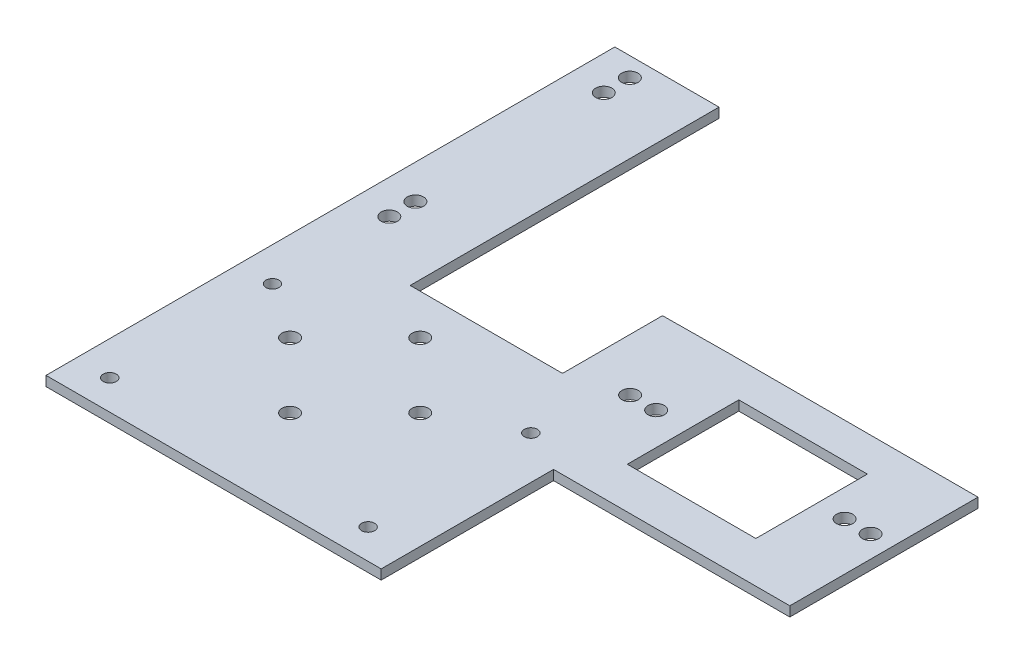
ISO-10303-21;
HEADER;
FILE_DESCRIPTION(('STEP AP214'),'2;1');
FILE_NAME('part.step','',(''),(''),'','','');
FILE_SCHEMA(('AUTOMOTIVE_DESIGN { 1 0 10303 214 1 1 1 1 }'));
ENDSEC;
DATA;
#1=APPLICATION_CONTEXT('core data for automotive mechanical design processes');
#2=APPLICATION_PROTOCOL_DEFINITION('international standard','automotive_design',2000,#1);
#3=PRODUCT_CONTEXT('',#1,'mechanical');
#4=PRODUCT('Part','Part','',(#3));
#5=PRODUCT_RELATED_PRODUCT_CATEGORY('part','',(#4));
#6=PRODUCT_DEFINITION_FORMATION('','',#4);
#7=PRODUCT_DEFINITION_CONTEXT('part definition',#1,'design');
#8=PRODUCT_DEFINITION('design','',#6,#7);
#9=PRODUCT_DEFINITION_SHAPE('','',#8);
#10=(LENGTH_UNIT() NAMED_UNIT(*) SI_UNIT(.MILLI.,.METRE.));
#11=(NAMED_UNIT(*) PLANE_ANGLE_UNIT() SI_UNIT($,.RADIAN.));
#12=(NAMED_UNIT(*) SI_UNIT($,.STERADIAN.) SOLID_ANGLE_UNIT());
#13=UNCERTAINTY_MEASURE_WITH_UNIT(LENGTH_MEASURE(1.E-05),#10,'distance_accuracy_value','');
#14=(GEOMETRIC_REPRESENTATION_CONTEXT(3) GLOBAL_UNCERTAINTY_ASSIGNED_CONTEXT((#13)) GLOBAL_UNIT_ASSIGNED_CONTEXT((#10,
#11,#12)) REPRESENTATION_CONTEXT('',''));
#15=CARTESIAN_POINT('',(0.,0.,0.));
#16=DIRECTION('',(0.,0.,1.));
#17=DIRECTION('',(1.,0.,0.));
#18=AXIS2_PLACEMENT_3D('',#15,#16,#17);
#19=CARTESIAN_POINT('',(0.,3.,0.));
#20=DIRECTION('',(0.,1.,0.));
#21=DIRECTION('',(0.,0.,1.));
#22=AXIS2_PLACEMENT_3D('',#19,#20,#21);
#23=PLANE('',#22);
#24=CARTESIAN_POINT('',(-89.5634434686842,3.,39.0070541785448));
#25=DIRECTION('',(0.,1.,0.));
#26=DIRECTION('',(0.,0.,1.));
#27=AXIS2_PLACEMENT_3D('',#24,#25,#26);
#28=CIRCLE('',#27,2.);
#29=CARTESIAN_POINT('',(-89.5634434686842,3.,41.0070541785448));
#30=VERTEX_POINT('',#29);
#31=EDGE_CURVE('E562',#30,#30,#28,.T.);
#32=ORIENTED_EDGE('',*,*,#31,.F.);
#33=EDGE_LOOP('',(#32));
#34=FACE_BOUND('',#33,.T.);
#35=CARTESIAN_POINT('',(-10.1646335647985,3.,89.0070541785448));
#36=DIRECTION('',(0.,1.,0.));
#37=DIRECTION('',(0.,0.,1.));
#38=AXIS2_PLACEMENT_3D('',#35,#36,#37);
#39=CIRCLE('',#38,2.);
#40=CARTESIAN_POINT('',(-10.1646335647985,3.,91.0070541785448));
#41=VERTEX_POINT('',#40);
#42=EDGE_CURVE('E560',#41,#41,#39,.T.);
#43=ORIENTED_EDGE('',*,*,#42,.F.);
#44=EDGE_LOOP('',(#43));
#45=FACE_BOUND('',#44,.T.);
#46=CARTESIAN_POINT('',(-89.5634434686841,3.,89.0070541785448));
#47=DIRECTION('',(0.,1.,0.));
#48=DIRECTION('',(0.,0.,1.));
#49=AXIS2_PLACEMENT_3D('',#46,#47,#48);
#50=CIRCLE('',#49,2.);
#51=CARTESIAN_POINT('',(-89.5634434686841,3.,91.0070541785448));
#52=VERTEX_POINT('',#51);
#53=EDGE_CURVE('E330',#52,#52,#50,.T.);
#54=ORIENTED_EDGE('',*,*,#53,.F.);
#55=EDGE_LOOP('',(#54));
#56=FACE_BOUND('',#55,.T.);
#57=CARTESIAN_POINT('',(-10.1646335647986,3.,39.0070541785448));
#58=DIRECTION('',(0.,1.,0.));
#59=DIRECTION('',(0.,0.,1.));
#60=AXIS2_PLACEMENT_3D('',#57,#58,#59);
#61=CIRCLE('',#60,2.);
#62=CARTESIAN_POINT('',(-10.1646335647986,3.,41.0070541785448));
#63=VERTEX_POINT('',#62);
#64=EDGE_CURVE('E565',#63,#63,#61,.T.);
#65=ORIENTED_EDGE('',*,*,#64,.F.);
#66=EDGE_LOOP('',(#65));
#67=FACE_BOUND('',#66,.T.);
#68=CARTESIAN_POINT('',(3.00000000000002,3.,13.6576257908728));
#69=DIRECTION('',(0.,1.,0.));
#70=DIRECTION('',(0.,0.,1.));
#71=AXIS2_PLACEMENT_3D('',#68,#69,#70);
#72=CIRCLE('',#71,2.5);
#73=CARTESIAN_POINT('',(3.00000000000002,3.,16.1576257908728));
#74=VERTEX_POINT('',#73);
#75=EDGE_CURVE('E185',#74,#74,#72,.T.);
#76=ORIENTED_EDGE('',*,*,#75,.F.);
#77=EDGE_LOOP('',(#76));
#78=FACE_BOUND('',#77,.T.);
#79=CARTESIAN_POINT('',(-89.4999999999999,3.,-4.84237420912721));
#80=DIRECTION('',(0.,1.,0.));
#81=DIRECTION('',(0.,0.,1.));
#82=AXIS2_PLACEMENT_3D('',#79,#80,#81);
#83=CIRCLE('',#82,2.5);
#84=CARTESIAN_POINT('',(-89.4999999999999,3.,-2.34237420912722));
#85=VERTEX_POINT('',#84);
#86=EDGE_CURVE('E197',#85,#85,#83,.T.);
#87=ORIENTED_EDGE('',*,*,#86,.F.);
#88=EDGE_LOOP('',(#87));
#89=FACE_BOUND('',#88,.T.);
#90=CARTESIAN_POINT('',(-89.4999999999998,3.,3.15762579087278));
#91=DIRECTION('',(0.,1.,0.));
#92=DIRECTION('',(0.,0.,1.));
#93=AXIS2_PLACEMENT_3D('',#90,#91,#92);
#94=CIRCLE('',#93,2.5);
#95=CARTESIAN_POINT('',(-89.4999999999998,3.,5.65762579087278));
#96=VERTEX_POINT('',#95);
#97=EDGE_CURVE('E209',#96,#96,#94,.T.);
#98=ORIENTED_EDGE('',*,*,#97,.F.);
#99=EDGE_LOOP('',(#98));
#100=FACE_BOUND('',#99,.T.);
#101=CARTESIAN_POINT('',(-32.4999999999998,3.,50.6576257908729));
#102=DIRECTION('',(0.,1.,0.));
#103=DIRECTION('',(0.,0.,1.));
#104=AXIS2_PLACEMENT_3D('',#101,#102,#103);
#105=CIRCLE('',#104,2.5);
#106=CARTESIAN_POINT('',(-32.4999999999998,3.,53.1576257908729));
#107=VERTEX_POINT('',#106);
#108=EDGE_CURVE('E221',#107,#107,#105,.T.);
#109=ORIENTED_EDGE('',*,*,#108,.F.);
#110=EDGE_LOOP('',(#109));
#111=FACE_BOUND('',#110,.T.);
#112=CARTESIAN_POINT('',(-72.4999999999992,3.,50.6576257908734));
#113=DIRECTION('',(0.,1.,0.));
#114=DIRECTION('',(0.,0.,1.));
#115=AXIS2_PLACEMENT_3D('',#112,#113,#114);
#116=CIRCLE('',#115,2.5);
#117=CARTESIAN_POINT('',(-72.4999999999992,3.,53.1576257908734));
#118=VERTEX_POINT('',#117);
#119=EDGE_CURVE('E233',#118,#118,#116,.T.);
#120=ORIENTED_EDGE('',*,*,#119,.F.);
#121=EDGE_LOOP('',(#120));
#122=FACE_BOUND('',#121,.T.);
#123=CARTESIAN_POINT('',(-52.5,3.,70.6576257908728));
#124=DIRECTION('',(0.,1.,0.));
#125=DIRECTION('',(0.,0.,1.));
#126=AXIS2_PLACEMENT_3D('',#123,#124,#125);
#127=CIRCLE('',#126,2.5);
#128=CARTESIAN_POINT('',(-52.5,3.,73.1576257908728));
#129=VERTEX_POINT('',#128);
#130=EDGE_CURVE('E245',#129,#129,#127,.T.);
#131=ORIENTED_EDGE('',*,*,#130,.F.);
#132=EDGE_LOOP('',(#131));
#133=FACE_BOUND('',#132,.T.);
#134=DIRECTION('',(1.,0.,0.));
#135=VECTOR('',#134,1.);
#136=CARTESIAN_POINT('',(-100.,3.,98.1576257908728));
#137=LINE('',#136,#135);
#138=CARTESIAN_POINT('',(-100.,3.,98.1576257908728));
#139=VERTEX_POINT('',#138);
#140=CARTESIAN_POINT('',(3.00000000000003,3.,98.1576257908728));
#141=VERTEX_POINT('',#140);
#142=EDGE_CURVE('E251',#139,#141,#137,.T.);
#143=ORIENTED_EDGE('',*,*,#142,.T.);
#144=DIRECTION('',(0.,0.,-1.));
#145=VECTOR('',#144,1.);
#146=CARTESIAN_POINT('',(3.00000000000003,3.,98.1576257908728));
#147=LINE('',#146,#145);
#148=CARTESIAN_POINT('',(3.00000000000003,3.,45.195936931762));
#149=VERTEX_POINT('',#148);
#150=EDGE_CURVE('E254',#141,#149,#147,.T.);
#151=ORIENTED_EDGE('',*,*,#150,.T.);
#152=DIRECTION('',(1.,0.,0.));
#153=VECTOR('',#152,1.);
#154=CARTESIAN_POINT('',(3.00000000000003,3.,45.195936931762));
#155=LINE('',#154,#153);
#156=CARTESIAN_POINT('',(75.6040568869683,3.,45.195936931762));
#157=VERTEX_POINT('',#156);
#158=EDGE_CURVE('E257',#149,#157,#155,.T.);
#159=ORIENTED_EDGE('',*,*,#158,.T.);
#160=DIRECTION('',(0.,0.,-1.));
#161=VECTOR('',#160,1.);
#162=CARTESIAN_POINT('',(75.6040568869683,3.,45.195936931762));
#163=LINE('',#162,#161);
#164=CARTESIAN_POINT('',(75.6040568869683,3.,-12.6368662491991));
#165=VERTEX_POINT('',#164);
#166=EDGE_CURVE('E259',#157,#165,#163,.T.);
#167=ORIENTED_EDGE('',*,*,#166,.T.);
#168=DIRECTION('',(-1.,0.,0.));
#169=VECTOR('',#168,1.);
#170=CARTESIAN_POINT('',(75.6040568869683,3.,-12.6368662491991));
#171=LINE('',#170,#169);
#172=CARTESIAN_POINT('',(-0.589568200358312,3.,-12.6368662491991));
#173=VERTEX_POINT('',#172);
#174=EDGE_CURVE('E261',#165,#173,#171,.T.);
#175=ORIENTED_EDGE('',*,*,#174,.T.);
#176=DIRECTION('',(-0.999957442788699,0.,0.00922564965119329));
#177=VECTOR('',#176,1.);
#178=CARTESIAN_POINT('',(-0.589568200358312,3.,-12.6368662491991));
#179=LINE('',#178,#177);
#180=CARTESIAN_POINT('',(-21.1648115551885,3.,-12.4470381839663));
#181=VERTEX_POINT('',#180);
#182=EDGE_CURVE('E263',#173,#181,#179,.T.);
#183=ORIENTED_EDGE('',*,*,#182,.T.);
#184=DIRECTION('',(0.,0.,1.));
#185=VECTOR('',#184,1.);
#186=CARTESIAN_POINT('',(-21.1648115551885,3.,-12.4470381839663));
#187=LINE('',#186,#185);
#188=CARTESIAN_POINT('',(-21.1648115551885,3.,18.2712434781188));
#189=VERTEX_POINT('',#188);
#190=EDGE_CURVE('E265',#181,#189,#187,.T.);
#191=ORIENTED_EDGE('',*,*,#190,.T.);
#192=DIRECTION('',(-1.,0.,0.));
#193=VECTOR('',#192,1.);
#194=CARTESIAN_POINT('',(-67.9806976310952,3.,18.2712434781188));
#195=LINE('',#194,#193);
#196=CARTESIAN_POINT('',(-67.9806976310952,3.,18.2712434781188));
#197=VERTEX_POINT('',#196);
#198=EDGE_CURVE('E267',#189,#197,#195,.T.);
#199=ORIENTED_EDGE('',*,*,#198,.T.);
#200=DIRECTION('',(0.,0.,-1.));
#201=VECTOR('',#200,1.);
#202=CARTESIAN_POINT('',(-67.9806976310952,3.,-12.6368662491991));
#203=LINE('',#202,#201);
#204=CARTESIAN_POINT('',(-67.9806976310952,3.,-76.642236504679));
#205=VERTEX_POINT('',#204);
#206=EDGE_CURVE('E269',#197,#205,#203,.T.);
#207=ORIENTED_EDGE('',*,*,#206,.T.);
#208=DIRECTION('',(-1.,0.,0.));
#209=VECTOR('',#208,1.);
#210=CARTESIAN_POINT('',(-100.,3.,-76.642236504679));
#211=LINE('',#210,#209);
#212=CARTESIAN_POINT('',(-100.,3.,-76.642236504679));
#213=VERTEX_POINT('',#212);
#214=EDGE_CURVE('E271',#205,#213,#211,.T.);
#215=ORIENTED_EDGE('',*,*,#214,.T.);
#216=DIRECTION('',(0.,0.,1.));
#217=VECTOR('',#216,1.);
#218=CARTESIAN_POINT('',(-100.,3.,-76.642236504679));
#219=LINE('',#218,#217);
#220=EDGE_CURVE('E273',#213,#139,#219,.T.);
#221=ORIENTED_EDGE('',*,*,#220,.T.);
#222=EDGE_LOOP('',(#143,#151,#159,#167,#175,#183,#191,#199,#207,#215,#221));
#223=FACE_BOUND('',#222,.T.);
#224=CARTESIAN_POINT('',(-4.99999999999998,3.,13.6576257908728));
#225=DIRECTION('',(0.,1.,0.));
#226=DIRECTION('',(0.,0.,1.));
#227=AXIS2_PLACEMENT_3D('',#224,#225,#226);
#228=CIRCLE('',#227,2.5);
#229=CARTESIAN_POINT('',(-4.99999999999998,3.,16.1576257908728));
#230=VERTEX_POINT('',#229);
#231=EDGE_CURVE('E239',#230,#230,#228,.T.);
#232=ORIENTED_EDGE('',*,*,#231,.F.);
#233=EDGE_LOOP('',(#232));
#234=FACE_BOUND('',#233,.T.);
#235=CARTESIAN_POINT('',(-52.4999999999998,3.,30.6576257908728));
#236=DIRECTION('',(0.,1.,0.));
#237=DIRECTION('',(0.,0.,1.));
#238=AXIS2_PLACEMENT_3D('',#235,#236,#237);
#239=CIRCLE('',#238,2.5);
#240=CARTESIAN_POINT('',(-52.4999999999998,3.,33.1576257908728));
#241=VERTEX_POINT('',#240);
#242=EDGE_CURVE('E227',#241,#241,#239,.T.);
#243=ORIENTED_EDGE('',*,*,#242,.F.);
#244=EDGE_LOOP('',(#243));
#245=FACE_BOUND('',#244,.T.);
#246=CARTESIAN_POINT('',(60.9,3.,13.6576257908728));
#247=DIRECTION('',(0.,1.,0.));
#248=DIRECTION('',(0.,0.,1.));
#249=AXIS2_PLACEMENT_3D('',#246,#247,#248);
#250=CIRCLE('',#249,2.50000000000001);
#251=CARTESIAN_POINT('',(60.9,3.,16.1576257908728));
#252=VERTEX_POINT('',#251);
#253=EDGE_CURVE('E215',#252,#252,#250,.T.);
#254=ORIENTED_EDGE('',*,*,#253,.F.);
#255=EDGE_LOOP('',(#254));
#256=FACE_BOUND('',#255,.T.);
#257=CARTESIAN_POINT('',(-89.4999999999998,3.,-62.7423742091272));
#258=DIRECTION('',(0.,1.,0.));
#259=DIRECTION('',(0.,0.,1.));
#260=AXIS2_PLACEMENT_3D('',#257,#258,#259);
#261=CIRCLE('',#260,2.5);
#262=CARTESIAN_POINT('',(-89.4999999999998,3.,-60.2423742091272));
#263=VERTEX_POINT('',#262);
#264=EDGE_CURVE('E203',#263,#263,#261,.T.);
#265=ORIENTED_EDGE('',*,*,#264,.F.);
#266=EDGE_LOOP('',(#265));
#267=FACE_BOUND('',#266,.T.);
#268=CARTESIAN_POINT('',(-89.4999999999999,3.,-70.7423742091272));
#269=DIRECTION('',(0.,1.,0.));
#270=DIRECTION('',(0.,0.,1.));
#271=AXIS2_PLACEMENT_3D('',#268,#269,#270);
#272=CIRCLE('',#271,2.5);
#273=CARTESIAN_POINT('',(-89.4999999999999,3.,-68.2423742091272));
#274=VERTEX_POINT('',#273);
#275=EDGE_CURVE('E191',#274,#274,#272,.T.);
#276=ORIENTED_EDGE('',*,*,#275,.F.);
#277=EDGE_LOOP('',(#276));
#278=FACE_BOUND('',#277,.T.);
#279=CARTESIAN_POINT('',(68.9,3.,13.6576257908728));
#280=DIRECTION('',(0.,1.,0.));
#281=DIRECTION('',(0.,0.,1.));
#282=AXIS2_PLACEMENT_3D('',#279,#280,#281);
#283=CIRCLE('',#282,2.5);
#284=CARTESIAN_POINT('',(68.9,3.,16.1576257908728));
#285=VERTEX_POINT('',#284);
#286=EDGE_CURVE('E179',#285,#285,#283,.T.);
#287=ORIENTED_EDGE('',*,*,#286,.F.);
#288=EDGE_LOOP('',(#287));
#289=FACE_BOUND('',#288,.T.);
#290=DIRECTION('',(1.,0.,0.));
#291=VECTOR('',#290,1.);
#292=CARTESIAN_POINT('',(12.969330424242,3.,32.5));
#293=LINE('',#292,#291);
#294=CARTESIAN_POINT('',(12.969330424242,3.,32.5));
#295=VERTEX_POINT('',#294);
#296=CARTESIAN_POINT('',(52.4736011810755,3.,32.5));
#297=VERTEX_POINT('',#296);
#298=EDGE_CURVE('E150',#295,#297,#293,.T.);
#299=ORIENTED_EDGE('',*,*,#298,.F.);
#300=DIRECTION('',(0.,0.,1.));
#301=VECTOR('',#300,1.);
#302=CARTESIAN_POINT('',(12.969330424242,3.,-1.76660972980732));
#303=LINE('',#302,#301);
#304=CARTESIAN_POINT('',(12.969330424242,3.,-1.76660972980732));
#305=VERTEX_POINT('',#304);
#306=EDGE_CURVE('E142',#305,#295,#303,.T.);
#307=ORIENTED_EDGE('',*,*,#306,.F.);
#308=DIRECTION('',(-1.,0.,0.));
#309=VECTOR('',#308,1.);
#310=CARTESIAN_POINT('',(12.969330424242,3.,-1.76660972980732));
#311=LINE('',#310,#309);
#312=CARTESIAN_POINT('',(52.4736011810755,3.,-1.76660972980732));
#313=VERTEX_POINT('',#312);
#314=EDGE_CURVE('E164',#313,#305,#311,.T.);
#315=ORIENTED_EDGE('',*,*,#314,.F.);
#316=DIRECTION('',(0.,0.,-1.));
#317=VECTOR('',#316,1.);
#318=CARTESIAN_POINT('',(52.4736011810755,3.,-1.76660972980732));
#319=LINE('',#318,#317);
#320=EDGE_CURVE('E162',#297,#313,#319,.T.);
#321=ORIENTED_EDGE('',*,*,#320,.F.);
#322=EDGE_LOOP('',(#299,#307,#315,#321));
#323=FACE_BOUND('',#322,.T.);
#324=ADVANCED_FACE('F33',(#34,#45,#56,#67,#78,#89,#100,#111,#122,#133,#223,#234,#245,#256,#267,
#278,#289,#323),#23,.T.);
#325=CARTESIAN_POINT('',(0.,0.,0.));
#326=DIRECTION('',(0.,1.,0.));
#327=DIRECTION('',(0.,0.,1.));
#328=AXIS2_PLACEMENT_3D('',#325,#326,#327);
#329=PLANE('',#328);
#330=CARTESIAN_POINT('',(-89.5634434686842,0.,39.0070541785448));
#331=DIRECTION('',(0.,1.,0.));
#332=DIRECTION('',(0.,0.,1.));
#333=AXIS2_PLACEMENT_3D('',#330,#331,#332);
#334=CIRCLE('',#333,2.);
#335=CARTESIAN_POINT('',(-89.5634434686842,0.,41.0070541785448));
#336=VERTEX_POINT('',#335);
#337=EDGE_CURVE('E37',#336,#336,#334,.T.);
#338=ORIENTED_EDGE('',*,*,#337,.T.);
#339=EDGE_LOOP('',(#338));
#340=FACE_BOUND('',#339,.T.);
#341=CARTESIAN_POINT('',(-10.1646335647985,0.,89.0070541785448));
#342=DIRECTION('',(0.,1.,0.));
#343=DIRECTION('',(0.,0.,1.));
#344=AXIS2_PLACEMENT_3D('',#341,#342,#343);
#345=CIRCLE('',#344,2.);
#346=CARTESIAN_POINT('',(-10.1646335647985,0.,91.0070541785448));
#347=VERTEX_POINT('',#346);
#348=EDGE_CURVE('E332',#347,#347,#345,.T.);
#349=ORIENTED_EDGE('',*,*,#348,.T.);
#350=EDGE_LOOP('',(#349));
#351=FACE_BOUND('',#350,.T.);
#352=CARTESIAN_POINT('',(-89.5634434686841,0.,89.0070541785448));
#353=DIRECTION('',(0.,1.,0.));
#354=DIRECTION('',(0.,0.,1.));
#355=AXIS2_PLACEMENT_3D('',#352,#353,#354);
#356=CIRCLE('',#355,2.);
#357=CARTESIAN_POINT('',(-89.5634434686841,0.,91.0070541785448));
#358=VERTEX_POINT('',#357);
#359=EDGE_CURVE('E329',#358,#358,#356,.T.);
#360=ORIENTED_EDGE('',*,*,#359,.T.);
#361=EDGE_LOOP('',(#360));
#362=FACE_BOUND('',#361,.T.);
#363=CARTESIAN_POINT('',(-10.1646335647986,0.,39.0070541785448));
#364=DIRECTION('',(0.,1.,0.));
#365=DIRECTION('',(0.,0.,1.));
#366=AXIS2_PLACEMENT_3D('',#363,#364,#365);
#367=CIRCLE('',#366,2.);
#368=CARTESIAN_POINT('',(-10.1646335647986,0.,41.0070541785448));
#369=VERTEX_POINT('',#368);
#370=EDGE_CURVE('E326',#369,#369,#367,.T.);
#371=ORIENTED_EDGE('',*,*,#370,.T.);
#372=EDGE_LOOP('',(#371));
#373=FACE_BOUND('',#372,.T.);
#374=CARTESIAN_POINT('',(68.9,0.,13.6576257908728));
#375=DIRECTION('',(0.,1.,0.));
#376=DIRECTION('',(0.,0.,1.));
#377=AXIS2_PLACEMENT_3D('',#374,#375,#376);
#378=CIRCLE('',#377,2.5);
#379=CARTESIAN_POINT('',(68.9,0.,16.1576257908728));
#380=VERTEX_POINT('',#379);
#381=EDGE_CURVE('E158',#380,#380,#378,.T.);
#382=ORIENTED_EDGE('',*,*,#381,.T.);
#383=EDGE_LOOP('',(#382));
#384=FACE_BOUND('',#383,.T.);
#385=CARTESIAN_POINT('',(3.00000000000002,0.,13.6576257908728));
#386=DIRECTION('',(0.,1.,0.));
#387=DIRECTION('',(0.,0.,1.));
#388=AXIS2_PLACEMENT_3D('',#385,#386,#387);
#389=CIRCLE('',#388,2.5);
#390=CARTESIAN_POINT('',(3.00000000000002,0.,16.1576257908728));
#391=VERTEX_POINT('',#390);
#392=EDGE_CURVE('E182',#391,#391,#389,.T.);
#393=ORIENTED_EDGE('',*,*,#392,.T.);
#394=EDGE_LOOP('',(#393));
#395=FACE_BOUND('',#394,.T.);
#396=CARTESIAN_POINT('',(-89.4999999999999,0.,-70.7423742091272));
#397=DIRECTION('',(0.,1.,0.));
#398=DIRECTION('',(0.,0.,1.));
#399=AXIS2_PLACEMENT_3D('',#396,#397,#398);
#400=CIRCLE('',#399,2.5);
#401=CARTESIAN_POINT('',(-89.4999999999999,0.,-68.2423742091272));
#402=VERTEX_POINT('',#401);
#403=EDGE_CURVE('E188',#402,#402,#400,.T.);
#404=ORIENTED_EDGE('',*,*,#403,.T.);
#405=EDGE_LOOP('',(#404));
#406=FACE_BOUND('',#405,.T.);
#407=CARTESIAN_POINT('',(-89.4999999999999,0.,-4.84237420912721));
#408=DIRECTION('',(0.,1.,0.));
#409=DIRECTION('',(0.,0.,1.));
#410=AXIS2_PLACEMENT_3D('',#407,#408,#409);
#411=CIRCLE('',#410,2.5);
#412=CARTESIAN_POINT('',(-89.4999999999999,0.,-2.34237420912722));
#413=VERTEX_POINT('',#412);
#414=EDGE_CURVE('E194',#413,#413,#411,.T.);
#415=ORIENTED_EDGE('',*,*,#414,.T.);
#416=EDGE_LOOP('',(#415));
#417=FACE_BOUND('',#416,.T.);
#418=CARTESIAN_POINT('',(-89.4999999999998,0.,-62.7423742091272));
#419=DIRECTION('',(0.,1.,0.));
#420=DIRECTION('',(0.,0.,1.));
#421=AXIS2_PLACEMENT_3D('',#418,#419,#420);
#422=CIRCLE('',#421,2.5);
#423=CARTESIAN_POINT('',(-89.4999999999998,0.,-60.2423742091272));
#424=VERTEX_POINT('',#423);
#425=EDGE_CURVE('E200',#424,#424,#422,.T.);
#426=ORIENTED_EDGE('',*,*,#425,.T.);
#427=EDGE_LOOP('',(#426));
#428=FACE_BOUND('',#427,.T.);
#429=CARTESIAN_POINT('',(-89.4999999999998,0.,3.15762579087278));
#430=DIRECTION('',(0.,1.,0.));
#431=DIRECTION('',(0.,0.,1.));
#432=AXIS2_PLACEMENT_3D('',#429,#430,#431);
#433=CIRCLE('',#432,2.5);
#434=CARTESIAN_POINT('',(-89.4999999999998,0.,5.65762579087278));
#435=VERTEX_POINT('',#434);
#436=EDGE_CURVE('E206',#435,#435,#433,.T.);
#437=ORIENTED_EDGE('',*,*,#436,.T.);
#438=EDGE_LOOP('',(#437));
#439=FACE_BOUND('',#438,.T.);
#440=CARTESIAN_POINT('',(60.9,0.,13.6576257908728));
#441=DIRECTION('',(0.,1.,0.));
#442=DIRECTION('',(0.,0.,1.));
#443=AXIS2_PLACEMENT_3D('',#440,#441,#442);
#444=CIRCLE('',#443,2.50000000000001);
#445=CARTESIAN_POINT('',(60.9,0.,16.1576257908728));
#446=VERTEX_POINT('',#445);
#447=EDGE_CURVE('E212',#446,#446,#444,.T.);
#448=ORIENTED_EDGE('',*,*,#447,.T.);
#449=EDGE_LOOP('',(#448));
#450=FACE_BOUND('',#449,.T.);
#451=CARTESIAN_POINT('',(-32.4999999999998,0.,50.6576257908729));
#452=DIRECTION('',(0.,1.,0.));
#453=DIRECTION('',(0.,0.,1.));
#454=AXIS2_PLACEMENT_3D('',#451,#452,#453);
#455=CIRCLE('',#454,2.5);
#456=CARTESIAN_POINT('',(-32.4999999999998,0.,53.1576257908729));
#457=VERTEX_POINT('',#456);
#458=EDGE_CURVE('E218',#457,#457,#455,.T.);
#459=ORIENTED_EDGE('',*,*,#458,.T.);
#460=EDGE_LOOP('',(#459));
#461=FACE_BOUND('',#460,.T.);
#462=CARTESIAN_POINT('',(-52.4999999999998,0.,30.6576257908728));
#463=DIRECTION('',(0.,1.,0.));
#464=DIRECTION('',(0.,0.,1.));
#465=AXIS2_PLACEMENT_3D('',#462,#463,#464);
#466=CIRCLE('',#465,2.5);
#467=CARTESIAN_POINT('',(-52.4999999999998,0.,33.1576257908728));
#468=VERTEX_POINT('',#467);
#469=EDGE_CURVE('E224',#468,#468,#466,.T.);
#470=ORIENTED_EDGE('',*,*,#469,.T.);
#471=EDGE_LOOP('',(#470));
#472=FACE_BOUND('',#471,.T.);
#473=CARTESIAN_POINT('',(-72.4999999999992,0.,50.6576257908734));
#474=DIRECTION('',(0.,1.,0.));
#475=DIRECTION('',(0.,0.,1.));
#476=AXIS2_PLACEMENT_3D('',#473,#474,#475);
#477=CIRCLE('',#476,2.5);
#478=CARTESIAN_POINT('',(-72.4999999999992,0.,53.1576257908734));
#479=VERTEX_POINT('',#478);
#480=EDGE_CURVE('E230',#479,#479,#477,.T.);
#481=ORIENTED_EDGE('',*,*,#480,.T.);
#482=EDGE_LOOP('',(#481));
#483=FACE_BOUND('',#482,.T.);
#484=CARTESIAN_POINT('',(-4.99999999999998,0.,13.6576257908728));
#485=DIRECTION('',(0.,1.,0.));
#486=DIRECTION('',(0.,0.,1.));
#487=AXIS2_PLACEMENT_3D('',#484,#485,#486);
#488=CIRCLE('',#487,2.5);
#489=CARTESIAN_POINT('',(-4.99999999999998,0.,16.1576257908728));
#490=VERTEX_POINT('',#489);
#491=EDGE_CURVE('E236',#490,#490,#488,.T.);
#492=ORIENTED_EDGE('',*,*,#491,.T.);
#493=EDGE_LOOP('',(#492));
#494=FACE_BOUND('',#493,.T.);
#495=CARTESIAN_POINT('',(-52.5,0.,70.6576257908728));
#496=DIRECTION('',(0.,1.,0.));
#497=DIRECTION('',(0.,0.,1.));
#498=AXIS2_PLACEMENT_3D('',#495,#496,#497);
#499=CIRCLE('',#498,2.5);
#500=CARTESIAN_POINT('',(-52.5,0.,73.1576257908728));
#501=VERTEX_POINT('',#500);
#502=EDGE_CURVE('E242',#501,#501,#499,.T.);
#503=ORIENTED_EDGE('',*,*,#502,.T.);
#504=EDGE_LOOP('',(#503));
#505=FACE_BOUND('',#504,.T.);
#506=DIRECTION('',(1.,0.,0.));
#507=VECTOR('',#506,1.);
#508=CARTESIAN_POINT('',(-100.,0.,98.1576257908728));
#509=LINE('',#508,#507);
#510=CARTESIAN_POINT('',(-100.,0.,98.1576257908728));
#511=VERTEX_POINT('',#510);
#512=CARTESIAN_POINT('',(3.00000000000003,0.,98.1576257908728));
#513=VERTEX_POINT('',#512);
#514=EDGE_CURVE('E248',#511,#513,#509,.T.);
#515=ORIENTED_EDGE('',*,*,#514,.F.);
#516=DIRECTION('',(0.,0.,1.));
#517=VECTOR('',#516,1.);
#518=CARTESIAN_POINT('',(-100.,0.,-76.642236504679));
#519=LINE('',#518,#517);
#520=CARTESIAN_POINT('',(-100.,0.,-76.642236504679));
#521=VERTEX_POINT('',#520);
#522=EDGE_CURVE('E255',#521,#511,#519,.T.);
#523=ORIENTED_EDGE('',*,*,#522,.F.);
#524=DIRECTION('',(-1.,0.,0.));
#525=VECTOR('',#524,1.);
#526=CARTESIAN_POINT('',(-100.,0.,-76.642236504679));
#527=LINE('',#526,#525);
#528=CARTESIAN_POINT('',(-67.9806976310952,0.,-76.642236504679));
#529=VERTEX_POINT('',#528);
#530=EDGE_CURVE('E295',#529,#521,#527,.T.);
#531=ORIENTED_EDGE('',*,*,#530,.F.);
#532=DIRECTION('',(0.,0.,-1.));
#533=VECTOR('',#532,1.);
#534=CARTESIAN_POINT('',(-67.9806976310952,0.,-12.6368662491991));
#535=LINE('',#534,#533);
#536=CARTESIAN_POINT('',(-67.9806976310952,0.,18.2712434781188));
#537=VERTEX_POINT('',#536);
#538=EDGE_CURVE('E293',#537,#529,#535,.T.);
#539=ORIENTED_EDGE('',*,*,#538,.F.);
#540=DIRECTION('',(-1.,0.,0.));
#541=VECTOR('',#540,1.);
#542=CARTESIAN_POINT('',(-67.9806976310952,0.,18.2712434781188));
#543=LINE('',#542,#541);
#544=CARTESIAN_POINT('',(-21.1648115551885,0.,18.2712434781188));
#545=VERTEX_POINT('',#544);
#546=EDGE_CURVE('E290',#545,#537,#543,.T.);
#547=ORIENTED_EDGE('',*,*,#546,.F.);
#548=DIRECTION('',(0.,0.,1.));
#549=VECTOR('',#548,1.);
#550=CARTESIAN_POINT('',(-21.1648115551885,0.,-12.4470381839663));
#551=LINE('',#550,#549);
#552=CARTESIAN_POINT('',(-21.1648115551885,0.,-12.4470381839663));
#553=VERTEX_POINT('',#552);
#554=EDGE_CURVE('E288',#553,#545,#551,.T.);
#555=ORIENTED_EDGE('',*,*,#554,.F.);
#556=DIRECTION('',(-0.999957442788699,0.,0.00922564965119329));
#557=VECTOR('',#556,1.);
#558=CARTESIAN_POINT('',(-0.589568200358312,0.,-12.6368662491991));
#559=LINE('',#558,#557);
#560=CARTESIAN_POINT('',(-0.589568200358312,0.,-12.6368662491991));
#561=VERTEX_POINT('',#560);
#562=EDGE_CURVE('E286',#561,#553,#559,.T.);
#563=ORIENTED_EDGE('',*,*,#562,.F.);
#564=DIRECTION('',(-1.,0.,0.));
#565=VECTOR('',#564,1.);
#566=CARTESIAN_POINT('',(75.6040568869683,0.,-12.6368662491991));
#567=LINE('',#566,#565);
#568=CARTESIAN_POINT('',(75.6040568869683,0.,-12.6368662491991));
#569=VERTEX_POINT('',#568);
#570=EDGE_CURVE('E284',#569,#561,#567,.T.);
#571=ORIENTED_EDGE('',*,*,#570,.F.);
#572=DIRECTION('',(0.,0.,-1.));
#573=VECTOR('',#572,1.);
#574=CARTESIAN_POINT('',(75.6040568869683,0.,45.195936931762));
#575=LINE('',#574,#573);
#576=CARTESIAN_POINT('',(75.6040568869683,0.,45.195936931762));
#577=VERTEX_POINT('',#576);
#578=EDGE_CURVE('E282',#577,#569,#575,.T.);
#579=ORIENTED_EDGE('',*,*,#578,.F.);
#580=DIRECTION('',(1.,0.,0.));
#581=VECTOR('',#580,1.);
#582=CARTESIAN_POINT('',(3.00000000000003,0.,45.195936931762));
#583=LINE('',#582,#581);
#584=CARTESIAN_POINT('',(3.00000000000003,0.,45.195936931762));
#585=VERTEX_POINT('',#584);
#586=EDGE_CURVE('E280',#585,#577,#583,.T.);
#587=ORIENTED_EDGE('',*,*,#586,.F.);
#588=DIRECTION('',(0.,0.,-1.));
#589=VECTOR('',#588,1.);
#590=CARTESIAN_POINT('',(3.00000000000003,0.,98.1576257908728));
#591=LINE('',#590,#589);
#592=EDGE_CURVE('E278',#513,#585,#591,.T.);
#593=ORIENTED_EDGE('',*,*,#592,.F.);
#594=EDGE_LOOP('',(#515,#523,#531,#539,#547,#555,#563,#571,#579,#587,#593));
#595=FACE_BOUND('',#594,.T.);
#596=DIRECTION('',(0.,0.,1.));
#597=VECTOR('',#596,1.);
#598=CARTESIAN_POINT('',(12.969330424242,0.,-1.76660972980732));
#599=LINE('',#598,#597);
#600=CARTESIAN_POINT('',(12.969330424242,0.,-1.76660972980732));
#601=VERTEX_POINT('',#600);
#602=CARTESIAN_POINT('',(12.969330424242,0.,32.5));
#603=VERTEX_POINT('',#602);
#604=EDGE_CURVE('E58',#601,#603,#599,.T.);
#605=ORIENTED_EDGE('',*,*,#604,.T.);
#606=DIRECTION('',(1.,0.,0.));
#607=VECTOR('',#606,1.);
#608=CARTESIAN_POINT('',(12.969330424242,0.,32.5));
#609=LINE('',#608,#607);
#610=CARTESIAN_POINT('',(52.4736011810755,0.,32.5));
#611=VERTEX_POINT('',#610);
#612=EDGE_CURVE('E157',#603,#611,#609,.T.);
#613=ORIENTED_EDGE('',*,*,#612,.T.);
#614=DIRECTION('',(0.,0.,-1.));
#615=VECTOR('',#614,1.);
#616=CARTESIAN_POINT('',(52.4736011810755,0.,-1.76660972980732));
#617=LINE('',#616,#615);
#618=CARTESIAN_POINT('',(52.4736011810755,0.,-1.76660972980732));
#619=VERTEX_POINT('',#618);
#620=EDGE_CURVE('E171',#611,#619,#617,.T.);
#621=ORIENTED_EDGE('',*,*,#620,.T.);
#622=DIRECTION('',(-1.,0.,0.));
#623=VECTOR('',#622,1.);
#624=CARTESIAN_POINT('',(12.969330424242,0.,-1.76660972980732));
#625=LINE('',#624,#623);
#626=EDGE_CURVE('E151',#619,#601,#625,.T.);
#627=ORIENTED_EDGE('',*,*,#626,.T.);
#628=EDGE_LOOP('',(#605,#613,#621,#627));
#629=FACE_BOUND('',#628,.T.);
#630=ADVANCED_FACE('F339',(#340,#351,#362,#373,#384,#395,#406,#417,#428,#439,#450,#461,#472,
#483,#494,#505,#595,#629),#329,.F.);
#631=CARTESIAN_POINT('',(-100.,3.,98.1576257908728));
#632=DIRECTION('',(0.,0.,-1.));
#633=DIRECTION('',(-1.,0.,0.));
#634=AXIS2_PLACEMENT_3D('',#631,#632,#633);
#635=PLANE('',#634);
#636=ORIENTED_EDGE('',*,*,#514,.T.);
#637=DIRECTION('',(0.,-1.,0.));
#638=VECTOR('',#637,1.);
#639=CARTESIAN_POINT('',(3.00000000000003,3.,98.1576257908728));
#640=LINE('',#639,#638);
#641=EDGE_CURVE('E11',#141,#513,#640,.T.);
#642=ORIENTED_EDGE('',*,*,#641,.F.);
#643=ORIENTED_EDGE('',*,*,#142,.F.);
#644=DIRECTION('',(0.,-1.,0.));
#645=VECTOR('',#644,1.);
#646=CARTESIAN_POINT('',(-100.,3.,98.1576257908728));
#647=LINE('',#646,#645);
#648=EDGE_CURVE('E275',#139,#511,#647,.T.);
#649=ORIENTED_EDGE('',*,*,#648,.T.);
#650=EDGE_LOOP('',(#636,#642,#643,#649));
#651=FACE_BOUND('',#650,.T.);
#652=ADVANCED_FACE('F35',(#651),#635,.F.);
#653=CARTESIAN_POINT('',(3.00000000000003,3.,98.1576257908728));
#654=DIRECTION('',(-1.,0.,0.));
#655=DIRECTION('',(0.,0.,1.));
#656=AXIS2_PLACEMENT_3D('',#653,#654,#655);
#657=PLANE('',#656);
#658=ORIENTED_EDGE('',*,*,#592,.T.);
#659=DIRECTION('',(0.,-1.,0.));
#660=VECTOR('',#659,1.);
#661=CARTESIAN_POINT('',(3.00000000000003,3.,45.195936931762));
#662=LINE('',#661,#660);
#663=EDGE_CURVE('E42',#149,#585,#662,.T.);
#664=ORIENTED_EDGE('',*,*,#663,.F.);
#665=ORIENTED_EDGE('',*,*,#150,.F.);
#666=ORIENTED_EDGE('',*,*,#641,.T.);
#667=EDGE_LOOP('',(#658,#664,#665,#666));
#668=FACE_BOUND('',#667,.T.);
#669=ADVANCED_FACE('F401',(#668),#657,.F.);
#670=CARTESIAN_POINT('',(3.00000000000003,3.,45.195936931762));
#671=DIRECTION('',(0.,0.,-1.));
#672=DIRECTION('',(-1.,0.,0.));
#673=AXIS2_PLACEMENT_3D('',#670,#671,#672);
#674=PLANE('',#673);
#675=ORIENTED_EDGE('',*,*,#586,.T.);
#676=DIRECTION('',(0.,-1.,0.));
#677=VECTOR('',#676,1.);
#678=CARTESIAN_POINT('',(75.6040568869683,3.,45.195936931762));
#679=LINE('',#678,#677);
#680=EDGE_CURVE('E321',#157,#577,#679,.T.);
#681=ORIENTED_EDGE('',*,*,#680,.F.);
#682=ORIENTED_EDGE('',*,*,#158,.F.);
#683=ORIENTED_EDGE('',*,*,#663,.T.);
#684=EDGE_LOOP('',(#675,#681,#682,#683));
#685=FACE_BOUND('',#684,.T.);
#686=ADVANCED_FACE('F398',(#685),#674,.F.);
#687=CARTESIAN_POINT('',(75.6040568869683,3.,45.195936931762));
#688=DIRECTION('',(-1.,0.,0.));
#689=DIRECTION('',(0.,0.,1.));
#690=AXIS2_PLACEMENT_3D('',#687,#688,#689);
#691=PLANE('',#690);
#692=ORIENTED_EDGE('',*,*,#578,.T.);
#693=DIRECTION('',(0.,-1.,0.));
#694=VECTOR('',#693,1.);
#695=CARTESIAN_POINT('',(75.6040568869683,3.,-12.6368662491991));
#696=LINE('',#695,#694);
#697=EDGE_CURVE('E318',#165,#569,#696,.T.);
#698=ORIENTED_EDGE('',*,*,#697,.F.);
#699=ORIENTED_EDGE('',*,*,#166,.F.);
#700=ORIENTED_EDGE('',*,*,#680,.T.);
#701=EDGE_LOOP('',(#692,#698,#699,#700));
#702=FACE_BOUND('',#701,.T.);
#703=ADVANCED_FACE('F394',(#702),#691,.F.);
#704=CARTESIAN_POINT('',(75.6040568869683,3.,-12.6368662491991));
#705=DIRECTION('',(0.,0.,1.));
#706=DIRECTION('',(1.,0.,0.));
#707=AXIS2_PLACEMENT_3D('',#704,#705,#706);
#708=PLANE('',#707);
#709=ORIENTED_EDGE('',*,*,#570,.T.);
#710=DIRECTION('',(0.,-1.,0.));
#711=VECTOR('',#710,1.);
#712=CARTESIAN_POINT('',(-0.589568200358312,3.,-12.6368662491991));
#713=LINE('',#712,#711);
#714=EDGE_CURVE('E315',#173,#561,#713,.T.);
#715=ORIENTED_EDGE('',*,*,#714,.F.);
#716=ORIENTED_EDGE('',*,*,#174,.F.);
#717=ORIENTED_EDGE('',*,*,#697,.T.);
#718=EDGE_LOOP('',(#709,#715,#716,#717));
#719=FACE_BOUND('',#718,.T.);
#720=ADVANCED_FACE('F390',(#719),#708,.F.);
#721=CARTESIAN_POINT('',(-0.589568200358312,3.,-12.6368662491991));
#722=DIRECTION('',(0.00922564965119329,0.,0.999957442788698));
#723=DIRECTION('',(0.999957442788699,0.,-0.00922564965119329));
#724=AXIS2_PLACEMENT_3D('',#721,#722,#723);
#725=PLANE('',#724);
#726=ORIENTED_EDGE('',*,*,#562,.T.);
#727=DIRECTION('',(0.,-1.,0.));
#728=VECTOR('',#727,1.);
#729=CARTESIAN_POINT('',(-21.1648115551885,3.,-12.4470381839663));
#730=LINE('',#729,#728);
#731=EDGE_CURVE('E312',#181,#553,#730,.T.);
#732=ORIENTED_EDGE('',*,*,#731,.F.);
#733=ORIENTED_EDGE('',*,*,#182,.F.);
#734=ORIENTED_EDGE('',*,*,#714,.T.);
#735=EDGE_LOOP('',(#726,#732,#733,#734));
#736=FACE_BOUND('',#735,.T.);
#737=ADVANCED_FACE('F386',(#736),#725,.F.);
#738=CARTESIAN_POINT('',(-21.1648115551885,3.,-12.4470381839663));
#739=DIRECTION('',(1.,0.,0.));
#740=DIRECTION('',(0.,0.,-1.));
#741=AXIS2_PLACEMENT_3D('',#738,#739,#740);
#742=PLANE('',#741);
#743=ORIENTED_EDGE('',*,*,#554,.T.);
#744=DIRECTION('',(0.,-1.,0.));
#745=VECTOR('',#744,1.);
#746=CARTESIAN_POINT('',(-21.1648115551885,3.,18.2712434781188));
#747=LINE('',#746,#745);
#748=EDGE_CURVE('E309',#189,#545,#747,.T.);
#749=ORIENTED_EDGE('',*,*,#748,.F.);
#750=ORIENTED_EDGE('',*,*,#190,.F.);
#751=ORIENTED_EDGE('',*,*,#731,.T.);
#752=EDGE_LOOP('',(#743,#749,#750,#751));
#753=FACE_BOUND('',#752,.T.);
#754=ADVANCED_FACE('F382',(#753),#742,.F.);
#755=CARTESIAN_POINT('',(-67.9806976310952,3.,18.2712434781188));
#756=DIRECTION('',(0.,0.,1.));
#757=DIRECTION('',(1.,0.,0.));
#758=AXIS2_PLACEMENT_3D('',#755,#756,#757);
#759=PLANE('',#758);
#760=ORIENTED_EDGE('',*,*,#546,.T.);
#761=DIRECTION('',(0.,-1.,0.));
#762=VECTOR('',#761,1.);
#763=CARTESIAN_POINT('',(-67.9806976310952,3.,18.2712434781188));
#764=LINE('',#763,#762);
#765=EDGE_CURVE('E306',#197,#537,#764,.T.);
#766=ORIENTED_EDGE('',*,*,#765,.F.);
#767=ORIENTED_EDGE('',*,*,#198,.F.);
#768=ORIENTED_EDGE('',*,*,#748,.T.);
#769=EDGE_LOOP('',(#760,#766,#767,#768));
#770=FACE_BOUND('',#769,.T.);
#771=ADVANCED_FACE('F378',(#770),#759,.F.);
#772=CARTESIAN_POINT('',(-67.9806976310952,3.,-12.6368662491991));
#773=DIRECTION('',(-1.,0.,0.));
#774=DIRECTION('',(0.,0.,1.));
#775=AXIS2_PLACEMENT_3D('',#772,#773,#774);
#776=PLANE('',#775);
#777=ORIENTED_EDGE('',*,*,#538,.T.);
#778=DIRECTION('',(0.,-1.,0.));
#779=VECTOR('',#778,1.);
#780=CARTESIAN_POINT('',(-67.9806976310952,3.,-76.642236504679));
#781=LINE('',#780,#779);
#782=EDGE_CURVE('E303',#205,#529,#781,.T.);
#783=ORIENTED_EDGE('',*,*,#782,.F.);
#784=ORIENTED_EDGE('',*,*,#206,.F.);
#785=ORIENTED_EDGE('',*,*,#765,.T.);
#786=EDGE_LOOP('',(#777,#783,#784,#785));
#787=FACE_BOUND('',#786,.T.);
#788=ADVANCED_FACE('F374',(#787),#776,.F.);
#789=CARTESIAN_POINT('',(-100.,3.,-76.642236504679));
#790=DIRECTION('',(0.,0.,1.));
#791=DIRECTION('',(1.,0.,0.));
#792=AXIS2_PLACEMENT_3D('',#789,#790,#791);
#793=PLANE('',#792);
#794=ORIENTED_EDGE('',*,*,#530,.T.);
#795=DIRECTION('',(0.,-1.,0.));
#796=VECTOR('',#795,1.);
#797=CARTESIAN_POINT('',(-100.,3.,-76.642236504679));
#798=LINE('',#797,#796);
#799=EDGE_CURVE('E300',#213,#521,#798,.T.);
#800=ORIENTED_EDGE('',*,*,#799,.F.);
#801=ORIENTED_EDGE('',*,*,#214,.F.);
#802=ORIENTED_EDGE('',*,*,#782,.T.);
#803=EDGE_LOOP('',(#794,#800,#801,#802));
#804=FACE_BOUND('',#803,.T.);
#805=ADVANCED_FACE('F370',(#804),#793,.F.);
#806=CARTESIAN_POINT('',(-100.,3.,-76.642236504679));
#807=DIRECTION('',(1.,0.,0.));
#808=DIRECTION('',(0.,0.,-1.));
#809=AXIS2_PLACEMENT_3D('',#806,#807,#808);
#810=PLANE('',#809);
#811=ORIENTED_EDGE('',*,*,#522,.T.);
#812=ORIENTED_EDGE('',*,*,#648,.F.);
#813=ORIENTED_EDGE('',*,*,#220,.F.);
#814=ORIENTED_EDGE('',*,*,#799,.T.);
#815=EDGE_LOOP('',(#811,#812,#813,#814));
#816=FACE_BOUND('',#815,.T.);
#817=ADVANCED_FACE('F367',(#816),#810,.F.);
#818=CARTESIAN_POINT('',(-52.5,3.,70.6576257908728));
#819=DIRECTION('',(0.,-1.,0.));
#820=DIRECTION('',(0.,0.,-1.));
#821=AXIS2_PLACEMENT_3D('',#818,#819,#820);
#822=CYLINDRICAL_SURFACE('',#821,2.5);
#823=ORIENTED_EDGE('',*,*,#130,.T.);
#824=EDGE_LOOP('',(#823));
#825=FACE_BOUND('',#824,.T.);
#826=ORIENTED_EDGE('',*,*,#502,.F.);
#827=EDGE_LOOP('',(#826));
#828=FACE_BOUND('',#827,.T.);
#829=ADVANCED_FACE('F364',(#825,#828),#822,.F.);
#830=CARTESIAN_POINT('',(-4.99999999999998,3.,13.6576257908728));
#831=DIRECTION('',(0.,-1.,0.));
#832=DIRECTION('',(0.,0.,-1.));
#833=AXIS2_PLACEMENT_3D('',#830,#831,#832);
#834=CYLINDRICAL_SURFACE('',#833,2.5);
#835=ORIENTED_EDGE('',*,*,#231,.T.);
#836=EDGE_LOOP('',(#835));
#837=FACE_BOUND('',#836,.T.);
#838=ORIENTED_EDGE('',*,*,#491,.F.);
#839=EDGE_LOOP('',(#838));
#840=FACE_BOUND('',#839,.T.);
#841=ADVANCED_FACE('F486',(#837,#840),#834,.F.);
#842=CARTESIAN_POINT('',(-72.4999999999992,3.,50.6576257908734));
#843=DIRECTION('',(0.,-1.,0.));
#844=DIRECTION('',(0.,0.,-1.));
#845=AXIS2_PLACEMENT_3D('',#842,#843,#844);
#846=CYLINDRICAL_SURFACE('',#845,2.5);
#847=ORIENTED_EDGE('',*,*,#119,.T.);
#848=EDGE_LOOP('',(#847));
#849=FACE_BOUND('',#848,.T.);
#850=ORIENTED_EDGE('',*,*,#480,.F.);
#851=EDGE_LOOP('',(#850));
#852=FACE_BOUND('',#851,.T.);
#853=ADVANCED_FACE('F491',(#849,#852),#846,.F.);
#854=CARTESIAN_POINT('',(-52.4999999999998,3.,30.6576257908728));
#855=DIRECTION('',(0.,-1.,0.));
#856=DIRECTION('',(0.,0.,-1.));
#857=AXIS2_PLACEMENT_3D('',#854,#855,#856);
#858=CYLINDRICAL_SURFACE('',#857,2.5);
#859=ORIENTED_EDGE('',*,*,#242,.T.);
#860=EDGE_LOOP('',(#859));
#861=FACE_BOUND('',#860,.T.);
#862=ORIENTED_EDGE('',*,*,#469,.F.);
#863=EDGE_LOOP('',(#862));
#864=FACE_BOUND('',#863,.T.);
#865=ADVANCED_FACE('F498',(#861,#864),#858,.F.);
#866=CARTESIAN_POINT('',(-32.4999999999998,3.,50.6576257908729));
#867=DIRECTION('',(0.,-1.,0.));
#868=DIRECTION('',(0.,0.,-1.));
#869=AXIS2_PLACEMENT_3D('',#866,#867,#868);
#870=CYLINDRICAL_SURFACE('',#869,2.5);
#871=ORIENTED_EDGE('',*,*,#108,.T.);
#872=EDGE_LOOP('',(#871));
#873=FACE_BOUND('',#872,.T.);
#874=ORIENTED_EDGE('',*,*,#458,.F.);
#875=EDGE_LOOP('',(#874));
#876=FACE_BOUND('',#875,.T.);
#877=ADVANCED_FACE('F505',(#873,#876),#870,.F.);
#878=CARTESIAN_POINT('',(60.9,3.,13.6576257908728));
#879=DIRECTION('',(0.,-1.,0.));
#880=DIRECTION('',(0.,0.,-1.));
#881=AXIS2_PLACEMENT_3D('',#878,#879,#880);
#882=CYLINDRICAL_SURFACE('',#881,2.50000000000001);
#883=ORIENTED_EDGE('',*,*,#253,.T.);
#884=EDGE_LOOP('',(#883));
#885=FACE_BOUND('',#884,.T.);
#886=ORIENTED_EDGE('',*,*,#447,.F.);
#887=EDGE_LOOP('',(#886));
#888=FACE_BOUND('',#887,.T.);
#889=ADVANCED_FACE('F509',(#885,#888),#882,.F.);
#890=CARTESIAN_POINT('',(-89.4999999999998,3.,3.15762579087278));
#891=DIRECTION('',(0.,-1.,0.));
#892=DIRECTION('',(0.,0.,-1.));
#893=AXIS2_PLACEMENT_3D('',#890,#891,#892);
#894=CYLINDRICAL_SURFACE('',#893,2.5);
#895=ORIENTED_EDGE('',*,*,#97,.T.);
#896=EDGE_LOOP('',(#895));
#897=FACE_BOUND('',#896,.T.);
#898=ORIENTED_EDGE('',*,*,#436,.F.);
#899=EDGE_LOOP('',(#898));
#900=FACE_BOUND('',#899,.T.);
#901=ADVANCED_FACE('F513',(#897,#900),#894,.F.);
#902=CARTESIAN_POINT('',(-89.4999999999998,3.,-62.7423742091272));
#903=DIRECTION('',(0.,-1.,0.));
#904=DIRECTION('',(0.,0.,-1.));
#905=AXIS2_PLACEMENT_3D('',#902,#903,#904);
#906=CYLINDRICAL_SURFACE('',#905,2.5);
#907=ORIENTED_EDGE('',*,*,#264,.T.);
#908=EDGE_LOOP('',(#907));
#909=FACE_BOUND('',#908,.T.);
#910=ORIENTED_EDGE('',*,*,#425,.F.);
#911=EDGE_LOOP('',(#910));
#912=FACE_BOUND('',#911,.T.);
#913=ADVANCED_FACE('F517',(#909,#912),#906,.F.);
#914=CARTESIAN_POINT('',(-89.4999999999999,3.,-4.84237420912721));
#915=DIRECTION('',(0.,-1.,0.));
#916=DIRECTION('',(0.,0.,-1.));
#917=AXIS2_PLACEMENT_3D('',#914,#915,#916);
#918=CYLINDRICAL_SURFACE('',#917,2.5);
#919=ORIENTED_EDGE('',*,*,#86,.T.);
#920=EDGE_LOOP('',(#919));
#921=FACE_BOUND('',#920,.T.);
#922=ORIENTED_EDGE('',*,*,#414,.F.);
#923=EDGE_LOOP('',(#922));
#924=FACE_BOUND('',#923,.T.);
#925=ADVANCED_FACE('F521',(#921,#924),#918,.F.);
#926=CARTESIAN_POINT('',(-89.4999999999999,3.,-70.7423742091272));
#927=DIRECTION('',(0.,-1.,0.));
#928=DIRECTION('',(0.,0.,-1.));
#929=AXIS2_PLACEMENT_3D('',#926,#927,#928);
#930=CYLINDRICAL_SURFACE('',#929,2.5);
#931=ORIENTED_EDGE('',*,*,#275,.T.);
#932=EDGE_LOOP('',(#931));
#933=FACE_BOUND('',#932,.T.);
#934=ORIENTED_EDGE('',*,*,#403,.F.);
#935=EDGE_LOOP('',(#934));
#936=FACE_BOUND('',#935,.T.);
#937=ADVANCED_FACE('F525',(#933,#936),#930,.F.);
#938=CARTESIAN_POINT('',(3.00000000000002,3.,13.6576257908728));
#939=DIRECTION('',(0.,-1.,0.));
#940=DIRECTION('',(0.,0.,-1.));
#941=AXIS2_PLACEMENT_3D('',#938,#939,#940);
#942=CYLINDRICAL_SURFACE('',#941,2.5);
#943=ORIENTED_EDGE('',*,*,#75,.T.);
#944=EDGE_LOOP('',(#943));
#945=FACE_BOUND('',#944,.T.);
#946=ORIENTED_EDGE('',*,*,#392,.F.);
#947=EDGE_LOOP('',(#946));
#948=FACE_BOUND('',#947,.T.);
#949=ADVANCED_FACE('F458',(#945,#948),#942,.F.);
#950=CARTESIAN_POINT('',(68.9,3.,13.6576257908728));
#951=DIRECTION('',(0.,-1.,0.));
#952=DIRECTION('',(0.,0.,-1.));
#953=AXIS2_PLACEMENT_3D('',#950,#951,#952);
#954=CYLINDRICAL_SURFACE('',#953,2.5);
#955=ORIENTED_EDGE('',*,*,#286,.T.);
#956=EDGE_LOOP('',(#955));
#957=FACE_BOUND('',#956,.T.);
#958=ORIENTED_EDGE('',*,*,#381,.F.);
#959=EDGE_LOOP('',(#958));
#960=FACE_BOUND('',#959,.T.);
#961=ADVANCED_FACE('F455',(#957,#960),#954,.F.);
#962=CARTESIAN_POINT('',(12.969330424242,3.,-1.76660972980732));
#963=DIRECTION('',(1.,0.,0.));
#964=DIRECTION('',(0.,0.,-1.));
#965=AXIS2_PLACEMENT_3D('',#962,#963,#964);
#966=PLANE('',#965);
#967=ORIENTED_EDGE('',*,*,#604,.F.);
#968=DIRECTION('',(0.,-1.,0.));
#969=VECTOR('',#968,1.);
#970=CARTESIAN_POINT('',(12.969330424242,3.,-1.76660972980732));
#971=LINE('',#970,#969);
#972=EDGE_CURVE('E146',#305,#601,#971,.T.);
#973=ORIENTED_EDGE('',*,*,#972,.F.);
#974=ORIENTED_EDGE('',*,*,#306,.T.);
#975=DIRECTION('',(0.,-1.,0.));
#976=VECTOR('',#975,1.);
#977=CARTESIAN_POINT('',(12.969330424242,3.,32.5));
#978=LINE('',#977,#976);
#979=EDGE_CURVE('E145',#295,#603,#978,.T.);
#980=ORIENTED_EDGE('',*,*,#979,.T.);
#981=EDGE_LOOP('',(#967,#973,#974,#980));
#982=FACE_BOUND('',#981,.T.);
#983=ADVANCED_FACE('F144',(#982),#966,.T.);
#984=CARTESIAN_POINT('',(12.969330424242,3.,32.5));
#985=DIRECTION('',(0.,0.,-1.));
#986=DIRECTION('',(-1.,0.,0.));
#987=AXIS2_PLACEMENT_3D('',#984,#985,#986);
#988=PLANE('',#987);
#989=ORIENTED_EDGE('',*,*,#612,.F.);
#990=ORIENTED_EDGE('',*,*,#979,.F.);
#991=ORIENTED_EDGE('',*,*,#298,.T.);
#992=DIRECTION('',(0.,-1.,0.));
#993=VECTOR('',#992,1.);
#994=CARTESIAN_POINT('',(52.4736011810755,3.,32.5));
#995=LINE('',#994,#993);
#996=EDGE_CURVE('E159',#297,#611,#995,.T.);
#997=ORIENTED_EDGE('',*,*,#996,.T.);
#998=EDGE_LOOP('',(#989,#990,#991,#997));
#999=FACE_BOUND('',#998,.T.);
#1000=ADVANCED_FACE('F154',(#999),#988,.T.);
#1001=CARTESIAN_POINT('',(52.4736011810755,3.,-1.76660972980732));
#1002=DIRECTION('',(-1.,0.,0.));
#1003=DIRECTION('',(0.,0.,1.));
#1004=AXIS2_PLACEMENT_3D('',#1001,#1002,#1003);
#1005=PLANE('',#1004);
#1006=ORIENTED_EDGE('',*,*,#620,.F.);
#1007=ORIENTED_EDGE('',*,*,#996,.F.);
#1008=ORIENTED_EDGE('',*,*,#320,.T.);
#1009=DIRECTION('',(0.,-1.,0.));
#1010=VECTOR('',#1009,1.);
#1011=CARTESIAN_POINT('',(52.4736011810755,3.,-1.76660972980732));
#1012=LINE('',#1011,#1010);
#1013=EDGE_CURVE('E50',#313,#619,#1012,.T.);
#1014=ORIENTED_EDGE('',*,*,#1013,.T.);
#1015=EDGE_LOOP('',(#1006,#1007,#1008,#1014));
#1016=FACE_BOUND('',#1015,.T.);
#1017=ADVANCED_FACE('F537',(#1016),#1005,.T.);
#1018=CARTESIAN_POINT('',(12.969330424242,3.,-1.76660972980732));
#1019=DIRECTION('',(0.,0.,1.));
#1020=DIRECTION('',(1.,0.,0.));
#1021=AXIS2_PLACEMENT_3D('',#1018,#1019,#1020);
#1022=PLANE('',#1021);
#1023=ORIENTED_EDGE('',*,*,#626,.F.);
#1024=ORIENTED_EDGE('',*,*,#1013,.F.);
#1025=ORIENTED_EDGE('',*,*,#314,.T.);
#1026=ORIENTED_EDGE('',*,*,#972,.T.);
#1027=EDGE_LOOP('',(#1023,#1024,#1025,#1026));
#1028=FACE_BOUND('',#1027,.T.);
#1029=ADVANCED_FACE('F540',(#1028),#1022,.T.);
#1030=CARTESIAN_POINT('',(-10.1646335647986,-7.,39.0070541785448));
#1031=DIRECTION('',(0.,1.,0.));
#1032=DIRECTION('',(0.,0.,1.));
#1033=AXIS2_PLACEMENT_3D('',#1030,#1031,#1032);
#1034=CYLINDRICAL_SURFACE('',#1033,2.);
#1035=ORIENTED_EDGE('',*,*,#64,.T.);
#1036=EDGE_LOOP('',(#1035));
#1037=FACE_BOUND('',#1036,.T.);
#1038=ORIENTED_EDGE('',*,*,#370,.F.);
#1039=EDGE_LOOP('',(#1038));
#1040=FACE_BOUND('',#1039,.T.);
#1041=ADVANCED_FACE('F543',(#1037,#1040),#1034,.F.);
#1042=CARTESIAN_POINT('',(-89.5634434686841,-7.,89.0070541785448));
#1043=DIRECTION('',(0.,1.,0.));
#1044=DIRECTION('',(0.,0.,1.));
#1045=AXIS2_PLACEMENT_3D('',#1042,#1043,#1044);
#1046=CYLINDRICAL_SURFACE('',#1045,2.);
#1047=ORIENTED_EDGE('',*,*,#53,.T.);
#1048=EDGE_LOOP('',(#1047));
#1049=FACE_BOUND('',#1048,.T.);
#1050=ORIENTED_EDGE('',*,*,#359,.F.);
#1051=EDGE_LOOP('',(#1050));
#1052=FACE_BOUND('',#1051,.T.);
#1053=ADVANCED_FACE('F349',(#1049,#1052),#1046,.F.);
#1054=CARTESIAN_POINT('',(-10.1646335647985,-7.,89.0070541785448));
#1055=DIRECTION('',(0.,1.,0.));
#1056=DIRECTION('',(0.,0.,1.));
#1057=AXIS2_PLACEMENT_3D('',#1054,#1055,#1056);
#1058=CYLINDRICAL_SURFACE('',#1057,2.);
#1059=ORIENTED_EDGE('',*,*,#42,.T.);
#1060=EDGE_LOOP('',(#1059));
#1061=FACE_BOUND('',#1060,.T.);
#1062=ORIENTED_EDGE('',*,*,#348,.F.);
#1063=EDGE_LOOP('',(#1062));
#1064=FACE_BOUND('',#1063,.T.);
#1065=ADVANCED_FACE('F343',(#1061,#1064),#1058,.F.);
#1066=CARTESIAN_POINT('',(-89.5634434686842,-7.,39.0070541785448));
#1067=DIRECTION('',(0.,1.,0.));
#1068=DIRECTION('',(0.,0.,1.));
#1069=AXIS2_PLACEMENT_3D('',#1066,#1067,#1068);
#1070=CYLINDRICAL_SURFACE('',#1069,2.);
#1071=ORIENTED_EDGE('',*,*,#31,.T.);
#1072=EDGE_LOOP('',(#1071));
#1073=FACE_BOUND('',#1072,.T.);
#1074=ORIENTED_EDGE('',*,*,#337,.F.);
#1075=EDGE_LOOP('',(#1074));
#1076=FACE_BOUND('',#1075,.T.);
#1077=ADVANCED_FACE('F341',(#1073,#1076),#1070,.F.);
#1078=CLOSED_SHELL('',(#324,#630,#652,#669,#686,#703,#720,#737,#754,#771,#788,#805,#817,#829,
#841,#853,#865,#877,#889,#901,#913,#925,#937,#949,#961,#983,#1000,#1017,#1029,#1041,#1053,#1065,#1077));
#1079=MANIFOLD_SOLID_BREP('B2',#1078);
#1080=ADVANCED_BREP_SHAPE_REPRESENTATION('',(#18,#1079),#14);
#1081=SHAPE_DEFINITION_REPRESENTATION(#9,#1080);
ENDSEC;
END-ISO-10303-21;
